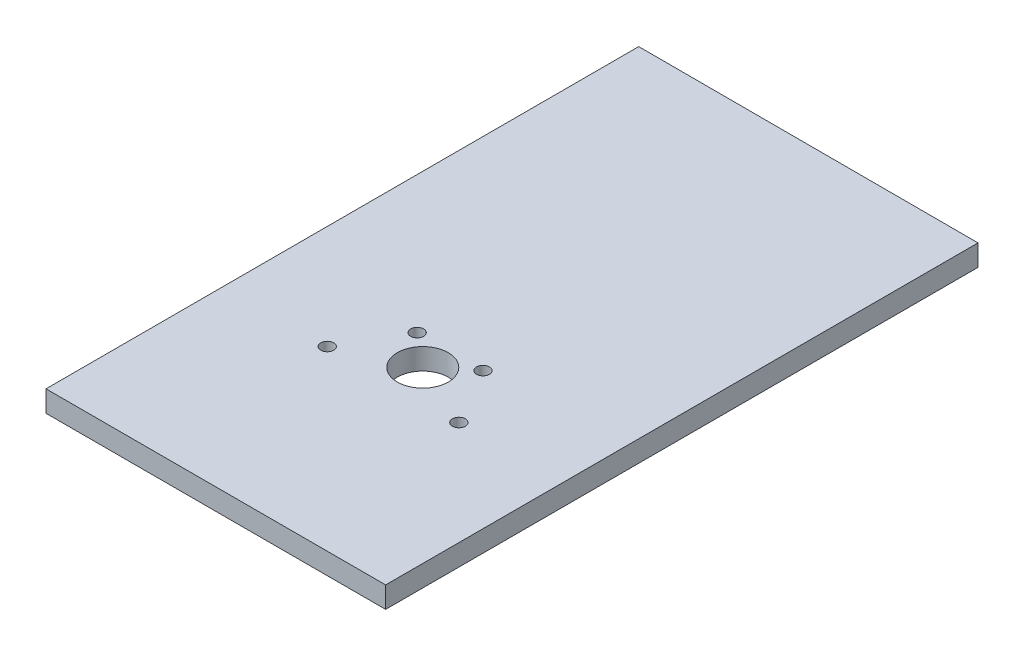
ISO-10303-21;
HEADER;
FILE_DESCRIPTION(('STEP AP214'),'2;1');
FILE_NAME('part.step','',(''),(''),'','','');
FILE_SCHEMA(('AUTOMOTIVE_DESIGN { 1 0 10303 214 1 1 1 1 }'));
ENDSEC;
DATA;
#1=APPLICATION_CONTEXT('core data for automotive mechanical design processes');
#2=APPLICATION_PROTOCOL_DEFINITION('international standard','automotive_design',2000,#1);
#3=PRODUCT_CONTEXT('',#1,'mechanical');
#4=PRODUCT('Part','Part','',(#3));
#5=PRODUCT_RELATED_PRODUCT_CATEGORY('part','',(#4));
#6=PRODUCT_DEFINITION_FORMATION('','',#4);
#7=PRODUCT_DEFINITION_CONTEXT('part definition',#1,'design');
#8=PRODUCT_DEFINITION('design','',#6,#7);
#9=PRODUCT_DEFINITION_SHAPE('','',#8);
#10=(LENGTH_UNIT() NAMED_UNIT(*) SI_UNIT(.MILLI.,.METRE.));
#11=(NAMED_UNIT(*) PLANE_ANGLE_UNIT() SI_UNIT($,.RADIAN.));
#12=(NAMED_UNIT(*) SI_UNIT($,.STERADIAN.) SOLID_ANGLE_UNIT());
#13=UNCERTAINTY_MEASURE_WITH_UNIT(LENGTH_MEASURE(1.E-05),#10,'distance_accuracy_value','');
#14=(GEOMETRIC_REPRESENTATION_CONTEXT(3) GLOBAL_UNCERTAINTY_ASSIGNED_CONTEXT((#13)) GLOBAL_UNIT_ASSIGNED_CONTEXT((#10,
#11,#12)) REPRESENTATION_CONTEXT('',''));
#15=CARTESIAN_POINT('',(0.,0.,0.));
#16=DIRECTION('',(0.,0.,1.));
#17=DIRECTION('',(1.,0.,0.));
#18=AXIS2_PLACEMENT_3D('',#15,#16,#17);
#19=CARTESIAN_POINT('',(0.,5.,0.));
#20=DIRECTION('',(0.,1.,0.));
#21=DIRECTION('',(0.,0.,1.));
#22=AXIS2_PLACEMENT_3D('',#19,#20,#21);
#23=PLANE('',#22);
#24=CARTESIAN_POINT('',(32.25,5.,124.826606241341));
#25=DIRECTION('',(0.,1.,0.));
#26=DIRECTION('',(0.,0.,1.));
#27=AXIS2_PLACEMENT_3D('',#24,#25,#26);
#28=CIRCLE('',#27,1.525);
#29=CARTESIAN_POINT('',(32.25,5.,126.351606241341));
#30=VERTEX_POINT('',#29);
#31=EDGE_CURVE('E127',#30,#30,#28,.T.);
#32=ORIENTED_EDGE('',*,*,#31,.F.);
#33=EDGE_LOOP('',(#32));
#34=FACE_BOUND('',#33,.T.);
#35=CARTESIAN_POINT('',(24.5,5.,138.25));
#36=DIRECTION('',(0.,1.,0.));
#37=DIRECTION('',(0.,0.,1.));
#38=AXIS2_PLACEMENT_3D('',#35,#36,#37);
#39=CIRCLE('',#38,1.52499999999999);
#40=CARTESIAN_POINT('',(24.5,5.,139.775));
#41=VERTEX_POINT('',#40);
#42=EDGE_CURVE('E115',#41,#41,#39,.T.);
#43=ORIENTED_EDGE('',*,*,#42,.F.);
#44=EDGE_LOOP('',(#43));
#45=FACE_BOUND('',#44,.T.);
#46=DIRECTION('',(0.,0.,1.));
#47=VECTOR('',#46,1.);
#48=CARTESIAN_POINT('',(0.,5.,40.3794602146901));
#49=LINE('',#48,#47);
#50=CARTESIAN_POINT('',(0.,5.,40.3794602146901));
#51=VERTEX_POINT('',#50);
#52=CARTESIAN_POINT('',(0.,5.,180.));
#53=VERTEX_POINT('',#52);
#54=EDGE_CURVE('E85',#51,#53,#49,.T.);
#55=ORIENTED_EDGE('',*,*,#54,.T.);
#56=DIRECTION('',(1.,0.,0.));
#57=VECTOR('',#56,1.);
#58=CARTESIAN_POINT('',(0.,5.,180.));
#59=LINE('',#58,#57);
#60=CARTESIAN_POINT('',(80.,5.,180.));
#61=VERTEX_POINT('',#60);
#62=EDGE_CURVE('E80',#53,#61,#59,.T.);
#63=ORIENTED_EDGE('',*,*,#62,.T.);
#64=DIRECTION('',(0.,0.,-1.));
#65=VECTOR('',#64,1.);
#66=CARTESIAN_POINT('',(80.,5.,40.4672842315765));
#67=LINE('',#66,#65);
#68=CARTESIAN_POINT('',(80.,5.,40.4672842315765));
#69=VERTEX_POINT('',#68);
#70=EDGE_CURVE('E83',#61,#69,#67,.T.);
#71=ORIENTED_EDGE('',*,*,#70,.T.);
#72=DIRECTION('',(-0.999999397417893,0.,-0.00109779954956483));
#73=VECTOR('',#72,1.);
#74=CARTESIAN_POINT('',(0.,5.,40.3794602146901));
#75=LINE('',#74,#73);
#76=EDGE_CURVE('E50',#69,#51,#75,.T.);
#77=ORIENTED_EDGE('',*,*,#76,.T.);
#78=EDGE_LOOP('',(#55,#63,#71,#77));
#79=FACE_BOUND('',#78,.T.);
#80=CARTESIAN_POINT('',(40.,5.,131.25));
#81=DIRECTION('',(0.,1.,0.));
#82=DIRECTION('',(0.,0.,1.));
#83=AXIS2_PLACEMENT_3D('',#80,#81,#82);
#84=CIRCLE('',#83,6.00000000000001);
#85=CARTESIAN_POINT('',(40.,5.,137.25));
#86=VERTEX_POINT('',#85);
#87=EDGE_CURVE('E100',#86,#86,#84,.T.);
#88=ORIENTED_EDGE('',*,*,#87,.F.);
#89=EDGE_LOOP('',(#88));
#90=FACE_BOUND('',#89,.T.);
#91=CARTESIAN_POINT('',(55.5,5.,138.25));
#92=DIRECTION('',(0.,1.,0.));
#93=DIRECTION('',(0.,0.,1.));
#94=AXIS2_PLACEMENT_3D('',#91,#92,#93);
#95=CIRCLE('',#94,1.525);
#96=CARTESIAN_POINT('',(55.5,5.,139.775));
#97=VERTEX_POINT('',#96);
#98=EDGE_CURVE('E121',#97,#97,#95,.T.);
#99=ORIENTED_EDGE('',*,*,#98,.F.);
#100=EDGE_LOOP('',(#99));
#101=FACE_BOUND('',#100,.T.);
#102=CARTESIAN_POINT('',(47.75,5.,124.826606241341));
#103=DIRECTION('',(0.,1.,0.));
#104=DIRECTION('',(0.,0.,1.));
#105=AXIS2_PLACEMENT_3D('',#102,#103,#104);
#106=CIRCLE('',#105,1.525);
#107=CARTESIAN_POINT('',(47.75,5.,126.351606241341));
#108=VERTEX_POINT('',#107);
#109=EDGE_CURVE('E133',#108,#108,#106,.T.);
#110=ORIENTED_EDGE('',*,*,#109,.F.);
#111=EDGE_LOOP('',(#110));
#112=FACE_BOUND('',#111,.T.);
#113=ADVANCED_FACE('F33',(#34,#45,#79,#90,#101,#112),#23,.T.);
#114=CARTESIAN_POINT('',(0.,0.,0.));
#115=DIRECTION('',(0.,1.,0.));
#116=DIRECTION('',(0.,0.,1.));
#117=AXIS2_PLACEMENT_3D('',#114,#115,#116);
#118=PLANE('',#117);
#119=DIRECTION('',(0.,0.,1.));
#120=VECTOR('',#119,1.);
#121=CARTESIAN_POINT('',(0.,0.,40.3794602146901));
#122=LINE('',#121,#120);
#123=CARTESIAN_POINT('',(0.,0.,40.3794602146901));
#124=VERTEX_POINT('',#123);
#125=CARTESIAN_POINT('',(0.,0.,180.));
#126=VERTEX_POINT('',#125);
#127=EDGE_CURVE('E97',#124,#126,#122,.T.);
#128=ORIENTED_EDGE('',*,*,#127,.F.);
#129=DIRECTION('',(-0.999999397417893,0.,-0.00109779954956483));
#130=VECTOR('',#129,1.);
#131=CARTESIAN_POINT('',(0.,0.,40.3794602146901));
#132=LINE('',#131,#130);
#133=CARTESIAN_POINT('',(80.,0.,40.4672842315765));
#134=VERTEX_POINT('',#133);
#135=EDGE_CURVE('E73',#134,#124,#132,.T.);
#136=ORIENTED_EDGE('',*,*,#135,.F.);
#137=DIRECTION('',(0.,0.,-1.));
#138=VECTOR('',#137,1.);
#139=CARTESIAN_POINT('',(80.,0.,40.4672842315765));
#140=LINE('',#139,#138);
#141=CARTESIAN_POINT('',(80.,0.,180.));
#142=VERTEX_POINT('',#141);
#143=EDGE_CURVE('E67',#142,#134,#140,.T.);
#144=ORIENTED_EDGE('',*,*,#143,.F.);
#145=DIRECTION('',(1.,0.,0.));
#146=VECTOR('',#145,1.);
#147=CARTESIAN_POINT('',(0.,0.,180.));
#148=LINE('',#147,#146);
#149=EDGE_CURVE('E89',#126,#142,#148,.T.);
#150=ORIENTED_EDGE('',*,*,#149,.F.);
#151=EDGE_LOOP('',(#128,#136,#144,#150));
#152=FACE_BOUND('',#151,.T.);
#153=CARTESIAN_POINT('',(40.,0.,131.25));
#154=DIRECTION('',(0.,1.,0.));
#155=DIRECTION('',(0.,0.,1.));
#156=AXIS2_PLACEMENT_3D('',#153,#154,#155);
#157=CIRCLE('',#156,6.00000000000001);
#158=CARTESIAN_POINT('',(40.,0.,137.25));
#159=VERTEX_POINT('',#158);
#160=EDGE_CURVE('E112',#159,#159,#157,.T.);
#161=ORIENTED_EDGE('',*,*,#160,.T.);
#162=EDGE_LOOP('',(#161));
#163=FACE_BOUND('',#162,.T.);
#164=CARTESIAN_POINT('',(24.5,0.,138.25));
#165=DIRECTION('',(0.,1.,0.));
#166=DIRECTION('',(0.,0.,1.));
#167=AXIS2_PLACEMENT_3D('',#164,#165,#166);
#168=CIRCLE('',#167,1.52499999999999);
#169=CARTESIAN_POINT('',(24.5,0.,139.775));
#170=VERTEX_POINT('',#169);
#171=EDGE_CURVE('E118',#170,#170,#168,.T.);
#172=ORIENTED_EDGE('',*,*,#171,.T.);
#173=EDGE_LOOP('',(#172));
#174=FACE_BOUND('',#173,.T.);
#175=CARTESIAN_POINT('',(55.5,0.,138.25));
#176=DIRECTION('',(0.,1.,0.));
#177=DIRECTION('',(0.,0.,1.));
#178=AXIS2_PLACEMENT_3D('',#175,#176,#177);
#179=CIRCLE('',#178,1.525);
#180=CARTESIAN_POINT('',(55.5,0.,139.775));
#181=VERTEX_POINT('',#180);
#182=EDGE_CURVE('E124',#181,#181,#179,.T.);
#183=ORIENTED_EDGE('',*,*,#182,.T.);
#184=EDGE_LOOP('',(#183));
#185=FACE_BOUND('',#184,.T.);
#186=CARTESIAN_POINT('',(32.25,0.,124.826606241341));
#187=DIRECTION('',(0.,1.,0.));
#188=DIRECTION('',(0.,0.,1.));
#189=AXIS2_PLACEMENT_3D('',#186,#187,#188);
#190=CIRCLE('',#189,1.525);
#191=CARTESIAN_POINT('',(32.25,0.,126.351606241341));
#192=VERTEX_POINT('',#191);
#193=EDGE_CURVE('E130',#192,#192,#190,.T.);
#194=ORIENTED_EDGE('',*,*,#193,.T.);
#195=EDGE_LOOP('',(#194));
#196=FACE_BOUND('',#195,.T.);
#197=CARTESIAN_POINT('',(47.75,0.,124.826606241341));
#198=DIRECTION('',(0.,1.,0.));
#199=DIRECTION('',(0.,0.,1.));
#200=AXIS2_PLACEMENT_3D('',#197,#198,#199);
#201=CIRCLE('',#200,1.525);
#202=CARTESIAN_POINT('',(47.75,0.,126.351606241341));
#203=VERTEX_POINT('',#202);
#204=EDGE_CURVE('E136',#203,#203,#201,.T.);
#205=ORIENTED_EDGE('',*,*,#204,.T.);
#206=EDGE_LOOP('',(#205));
#207=FACE_BOUND('',#206,.T.);
#208=ADVANCED_FACE('F108',(#152,#163,#174,#185,#196,#207),#118,.F.);
#209=CARTESIAN_POINT('',(0.,5.,40.3794602146901));
#210=DIRECTION('',(1.,0.,0.));
#211=DIRECTION('',(0.,0.,-1.));
#212=AXIS2_PLACEMENT_3D('',#209,#210,#211);
#213=PLANE('',#212);
#214=ORIENTED_EDGE('',*,*,#127,.T.);
#215=DIRECTION('',(0.,-1.,0.));
#216=VECTOR('',#215,1.);
#217=CARTESIAN_POINT('',(0.,5.,180.));
#218=LINE('',#217,#216);
#219=EDGE_CURVE('E11',#53,#126,#218,.T.);
#220=ORIENTED_EDGE('',*,*,#219,.F.);
#221=ORIENTED_EDGE('',*,*,#54,.F.);
#222=DIRECTION('',(0.,-1.,0.));
#223=VECTOR('',#222,1.);
#224=CARTESIAN_POINT('',(0.,5.,40.3794602146901));
#225=LINE('',#224,#223);
#226=EDGE_CURVE('E93',#51,#124,#225,.T.);
#227=ORIENTED_EDGE('',*,*,#226,.T.);
#228=EDGE_LOOP('',(#214,#220,#221,#227));
#229=FACE_BOUND('',#228,.T.);
#230=ADVANCED_FACE('F35',(#229),#213,.F.);
#231=CARTESIAN_POINT('',(0.,5.,180.));
#232=DIRECTION('',(0.,0.,-1.));
#233=DIRECTION('',(-1.,0.,0.));
#234=AXIS2_PLACEMENT_3D('',#231,#232,#233);
#235=PLANE('',#234);
#236=ORIENTED_EDGE('',*,*,#149,.T.);
#237=DIRECTION('',(0.,-1.,0.));
#238=VECTOR('',#237,1.);
#239=CARTESIAN_POINT('',(80.,5.,180.));
#240=LINE('',#239,#238);
#241=EDGE_CURVE('E42',#61,#142,#240,.T.);
#242=ORIENTED_EDGE('',*,*,#241,.F.);
#243=ORIENTED_EDGE('',*,*,#62,.F.);
#244=ORIENTED_EDGE('',*,*,#219,.T.);
#245=EDGE_LOOP('',(#236,#242,#243,#244));
#246=FACE_BOUND('',#245,.T.);
#247=ADVANCED_FACE('F88',(#246),#235,.F.);
#248=CARTESIAN_POINT('',(80.,5.,40.4672842315765));
#249=DIRECTION('',(-1.,0.,0.));
#250=DIRECTION('',(0.,0.,1.));
#251=AXIS2_PLACEMENT_3D('',#248,#249,#250);
#252=PLANE('',#251);
#253=ORIENTED_EDGE('',*,*,#143,.T.);
#254=DIRECTION('',(0.,-1.,0.));
#255=VECTOR('',#254,1.);
#256=CARTESIAN_POINT('',(80.,5.,40.4672842315765));
#257=LINE('',#256,#255);
#258=EDGE_CURVE('E90',#69,#134,#257,.T.);
#259=ORIENTED_EDGE('',*,*,#258,.F.);
#260=ORIENTED_EDGE('',*,*,#70,.F.);
#261=ORIENTED_EDGE('',*,*,#241,.T.);
#262=EDGE_LOOP('',(#253,#259,#260,#261));
#263=FACE_BOUND('',#262,.T.);
#264=ADVANCED_FACE('F91',(#263),#252,.F.);
#265=CARTESIAN_POINT('',(0.,5.,40.3794602146901));
#266=DIRECTION('',(-0.00109779954956483,0.,0.999999397417893));
#267=DIRECTION('',(0.999999397417893,0.,0.00109779954956483));
#268=AXIS2_PLACEMENT_3D('',#265,#266,#267);
#269=PLANE('',#268);
#270=ORIENTED_EDGE('',*,*,#135,.T.);
#271=ORIENTED_EDGE('',*,*,#226,.F.);
#272=ORIENTED_EDGE('',*,*,#76,.F.);
#273=ORIENTED_EDGE('',*,*,#258,.T.);
#274=EDGE_LOOP('',(#270,#271,#272,#273));
#275=FACE_BOUND('',#274,.T.);
#276=ADVANCED_FACE('F105',(#275),#269,.F.);
#277=CARTESIAN_POINT('',(40.,5.,131.25));
#278=DIRECTION('',(0.,-1.,0.));
#279=DIRECTION('',(0.,0.,-1.));
#280=AXIS2_PLACEMENT_3D('',#277,#278,#279);
#281=CYLINDRICAL_SURFACE('',#280,6.00000000000001);
#282=ORIENTED_EDGE('',*,*,#87,.T.);
#283=EDGE_LOOP('',(#282));
#284=FACE_BOUND('',#283,.T.);
#285=ORIENTED_EDGE('',*,*,#160,.F.);
#286=EDGE_LOOP('',(#285));
#287=FACE_BOUND('',#286,.T.);
#288=ADVANCED_FACE('F155',(#284,#287),#281,.F.);
#289=CARTESIAN_POINT('',(24.5,5.,138.25));
#290=DIRECTION('',(0.,-1.,0.));
#291=DIRECTION('',(0.,0.,-1.));
#292=AXIS2_PLACEMENT_3D('',#289,#290,#291);
#293=CYLINDRICAL_SURFACE('',#292,1.52499999999999);
#294=ORIENTED_EDGE('',*,*,#42,.T.);
#295=EDGE_LOOP('',(#294));
#296=FACE_BOUND('',#295,.T.);
#297=ORIENTED_EDGE('',*,*,#171,.F.);
#298=EDGE_LOOP('',(#297));
#299=FACE_BOUND('',#298,.T.);
#300=ADVANCED_FACE('F201',(#296,#299),#293,.F.);
#301=CARTESIAN_POINT('',(55.5,5.,138.25));
#302=DIRECTION('',(0.,-1.,0.));
#303=DIRECTION('',(0.,0.,-1.));
#304=AXIS2_PLACEMENT_3D('',#301,#302,#303);
#305=CYLINDRICAL_SURFACE('',#304,1.525);
#306=ORIENTED_EDGE('',*,*,#98,.T.);
#307=EDGE_LOOP('',(#306));
#308=FACE_BOUND('',#307,.T.);
#309=ORIENTED_EDGE('',*,*,#182,.F.);
#310=EDGE_LOOP('',(#309));
#311=FACE_BOUND('',#310,.T.);
#312=ADVANCED_FACE('F209',(#308,#311),#305,.F.);
#313=CARTESIAN_POINT('',(32.25,5.,124.826606241341));
#314=DIRECTION('',(0.,-1.,0.));
#315=DIRECTION('',(0.,0.,-1.));
#316=AXIS2_PLACEMENT_3D('',#313,#314,#315);
#317=CYLINDRICAL_SURFACE('',#316,1.525);
#318=ORIENTED_EDGE('',*,*,#31,.T.);
#319=EDGE_LOOP('',(#318));
#320=FACE_BOUND('',#319,.T.);
#321=ORIENTED_EDGE('',*,*,#193,.F.);
#322=EDGE_LOOP('',(#321));
#323=FACE_BOUND('',#322,.T.);
#324=ADVANCED_FACE('F217',(#320,#323),#317,.F.);
#325=CARTESIAN_POINT('',(47.75,5.,124.826606241341));
#326=DIRECTION('',(0.,-1.,0.));
#327=DIRECTION('',(0.,0.,-1.));
#328=AXIS2_PLACEMENT_3D('',#325,#326,#327);
#329=CYLINDRICAL_SURFACE('',#328,1.525);
#330=ORIENTED_EDGE('',*,*,#109,.T.);
#331=EDGE_LOOP('',(#330));
#332=FACE_BOUND('',#331,.T.);
#333=ORIENTED_EDGE('',*,*,#204,.F.);
#334=EDGE_LOOP('',(#333));
#335=FACE_BOUND('',#334,.T.);
#336=ADVANCED_FACE('F142',(#332,#335),#329,.F.);
#337=CLOSED_SHELL('',(#113,#208,#230,#247,#264,#276,#288,#300,#312,#324,#336));
#338=MANIFOLD_SOLID_BREP('B2',#337);
#339=ADVANCED_BREP_SHAPE_REPRESENTATION('',(#18,#338),#14);
#340=SHAPE_DEFINITION_REPRESENTATION(#9,#339);
ENDSEC;
END-ISO-10303-21;
